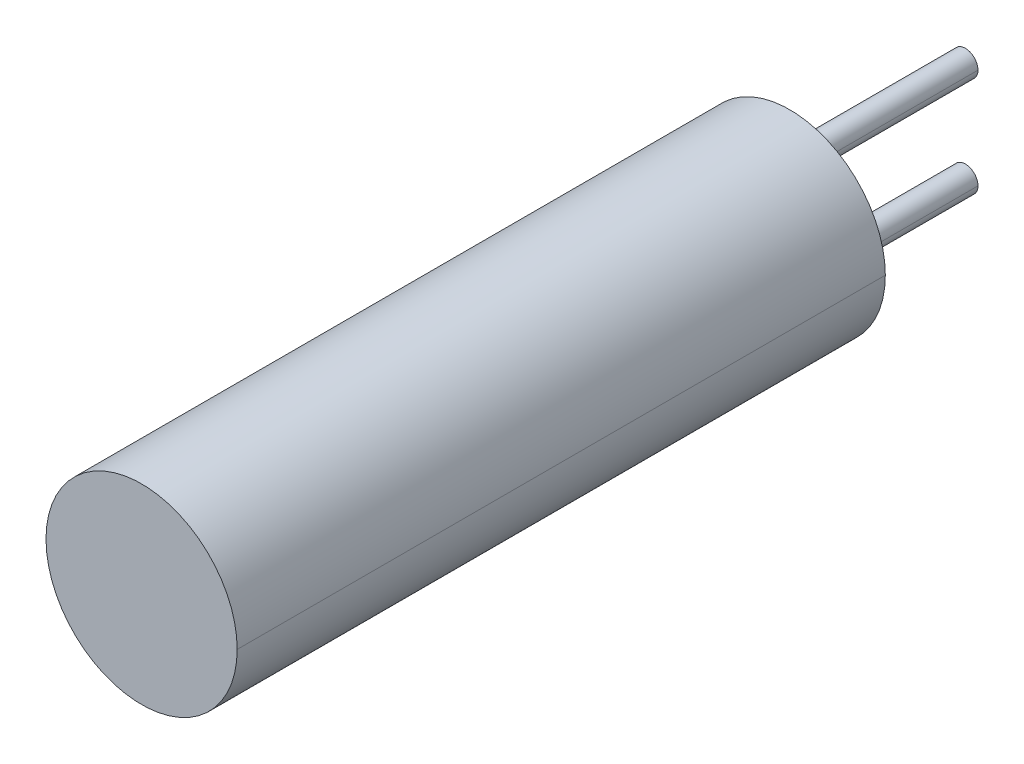
ISO-10303-21;
HEADER;
FILE_DESCRIPTION(('STEP AP214'),'2;1');
FILE_NAME('part.step','',(''),(''),'','','');
FILE_SCHEMA(('AUTOMOTIVE_DESIGN { 1 0 10303 214 1 1 1 1 }'));
ENDSEC;
DATA;
#1=APPLICATION_CONTEXT('core data for automotive mechanical design processes');
#2=APPLICATION_PROTOCOL_DEFINITION('international standard','automotive_design',2000,#1);
#3=PRODUCT_CONTEXT('',#1,'mechanical');
#4=PRODUCT('Part','Part','',(#3));
#5=PRODUCT_RELATED_PRODUCT_CATEGORY('part','',(#4));
#6=PRODUCT_DEFINITION_FORMATION('','',#4);
#7=PRODUCT_DEFINITION_CONTEXT('part definition',#1,'design');
#8=PRODUCT_DEFINITION('design','',#6,#7);
#9=PRODUCT_DEFINITION_SHAPE('','',#8);
#10=(LENGTH_UNIT() NAMED_UNIT(*) SI_UNIT(.MILLI.,.METRE.));
#11=(NAMED_UNIT(*) PLANE_ANGLE_UNIT() SI_UNIT($,.RADIAN.));
#12=(NAMED_UNIT(*) SI_UNIT($,.STERADIAN.) SOLID_ANGLE_UNIT());
#13=UNCERTAINTY_MEASURE_WITH_UNIT(LENGTH_MEASURE(1.E-05),#10,'distance_accuracy_value','');
#14=(GEOMETRIC_REPRESENTATION_CONTEXT(3) GLOBAL_UNCERTAINTY_ASSIGNED_CONTEXT((#13)) GLOBAL_UNIT_ASSIGNED_CONTEXT((#10,
#11,#12)) REPRESENTATION_CONTEXT('',''));
#15=CARTESIAN_POINT('',(0.,0.,0.));
#16=DIRECTION('',(0.,0.,1.));
#17=DIRECTION('',(1.,0.,0.));
#18=AXIS2_PLACEMENT_3D('',#15,#16,#17);
#19=CARTESIAN_POINT('',(0.,0.,0.));
#20=DIRECTION('',(0.,0.,1.));
#21=DIRECTION('',(-1.,0.,0.));
#22=AXIS2_PLACEMENT_3D('',#19,#20,#21);
#23=PLANE('',#22);
#24=CARTESIAN_POINT('',(0.,0.,0.));
#25=DIRECTION('',(0.,0.,1.));
#26=DIRECTION('',(-1.,0.,0.));
#27=AXIS2_PLACEMENT_3D('',#24,#25,#26);
#28=CIRCLE('',#27,2.95);
#29=CARTESIAN_POINT('',(-2.95,0.,0.));
#30=VERTEX_POINT('',#29);
#31=CARTESIAN_POINT('',(2.95,0.,0.));
#32=VERTEX_POINT('',#31);
#33=EDGE_CURVE('E38',#30,#32,#28,.T.);
#34=ORIENTED_EDGE('',*,*,#33,.F.);
#35=CARTESIAN_POINT('',(0.,0.,0.));
#36=DIRECTION('',(0.,0.,1.));
#37=DIRECTION('',(1.,0.,0.));
#38=AXIS2_PLACEMENT_3D('',#35,#36,#37);
#39=CIRCLE('',#38,2.95);
#40=EDGE_CURVE('E105',#32,#30,#39,.T.);
#41=ORIENTED_EDGE('',*,*,#40,.F.);
#42=EDGE_LOOP('',(#34,#41));
#43=FACE_BOUND('',#42,.T.);
#44=CARTESIAN_POINT('',(0.,1.489822979376,0.));
#45=DIRECTION('',(0.,0.,-1.));
#46=DIRECTION('',(1.,0.,0.));
#47=AXIS2_PLACEMENT_3D('',#44,#45,#46);
#48=CIRCLE('',#47,0.3898185985847);
#49=CARTESIAN_POINT('',(0.3898185985847,1.489822979376,0.));
#50=VERTEX_POINT('',#49);
#51=CARTESIAN_POINT('',(-0.3898185985847,1.489822979376,0.));
#52=VERTEX_POINT('',#51);
#53=EDGE_CURVE('E83',#50,#52,#48,.T.);
#54=ORIENTED_EDGE('',*,*,#53,.F.);
#55=CARTESIAN_POINT('',(0.,1.489822979376,0.));
#56=DIRECTION('',(0.,0.,-1.));
#57=DIRECTION('',(-1.,0.,0.));
#58=AXIS2_PLACEMENT_3D('',#55,#56,#57);
#59=CIRCLE('',#58,0.3898185985847);
#60=EDGE_CURVE('E116',#52,#50,#59,.T.);
#61=ORIENTED_EDGE('',*,*,#60,.F.);
#62=EDGE_LOOP('',(#54,#61));
#63=FACE_BOUND('',#62,.T.);
#64=CARTESIAN_POINT('',(0.,-1.602262449517,0.));
#65=DIRECTION('',(0.,0.,-1.));
#66=DIRECTION('',(1.,0.,0.));
#67=AXIS2_PLACEMENT_3D('',#64,#65,#66);
#68=CIRCLE('',#67,0.3898185985847);
#69=CARTESIAN_POINT('',(0.3898185985847,-1.602262449517,0.));
#70=VERTEX_POINT('',#69);
#71=CARTESIAN_POINT('',(-0.3898185985847,-1.602262449517,0.));
#72=VERTEX_POINT('',#71);
#73=EDGE_CURVE('E85',#70,#72,#68,.T.);
#74=ORIENTED_EDGE('',*,*,#73,.F.);
#75=CARTESIAN_POINT('',(0.,-1.602262449517,0.));
#76=DIRECTION('',(0.,0.,-1.));
#77=DIRECTION('',(-1.,0.,0.));
#78=AXIS2_PLACEMENT_3D('',#75,#76,#77);
#79=CIRCLE('',#78,0.3898185985847);
#80=EDGE_CURVE('E79',#72,#70,#79,.T.);
#81=ORIENTED_EDGE('',*,*,#80,.F.);
#82=EDGE_LOOP('',(#74,#81));
#83=FACE_BOUND('',#82,.T.);
#84=ADVANCED_FACE('F17',(#43,#63,#83),#23,.F.);
#85=CARTESIAN_POINT('',(0.,0.,0.));
#86=DIRECTION('',(0.,0.,1.));
#87=DIRECTION('',(-1.,0.,0.));
#88=AXIS2_PLACEMENT_3D('',#85,#86,#87);
#89=CYLINDRICAL_SURFACE('',#88,2.95);
#90=DIRECTION('',(0.,0.,-1.));
#91=VECTOR('',#90,1.);
#92=CARTESIAN_POINT('',(-2.95,0.,20.));
#93=LINE('',#92,#91);
#94=CARTESIAN_POINT('',(-2.95,0.,20.));
#95=VERTEX_POINT('',#94);
#96=EDGE_CURVE('E102',#30,#95,#93,.F.);
#97=ORIENTED_EDGE('',*,*,#96,.T.);
#98=CARTESIAN_POINT('',(0.,0.,20.));
#99=DIRECTION('',(0.,0.,-1.));
#100=DIRECTION('',(-1.,0.,0.));
#101=AXIS2_PLACEMENT_3D('',#98,#99,#100);
#102=CIRCLE('',#101,2.95);
#103=CARTESIAN_POINT('',(2.95,0.,20.));
#104=VERTEX_POINT('',#103);
#105=EDGE_CURVE('E11',#95,#104,#102,.T.);
#106=ORIENTED_EDGE('',*,*,#105,.T.);
#107=DIRECTION('',(0.,0.,-1.));
#108=VECTOR('',#107,1.);
#109=CARTESIAN_POINT('',(2.95,0.,20.));
#110=LINE('',#109,#108);
#111=EDGE_CURVE('E29',#32,#104,#110,.F.);
#112=ORIENTED_EDGE('',*,*,#111,.F.);
#113=ORIENTED_EDGE('',*,*,#40,.T.);
#114=EDGE_LOOP('',(#97,#106,#112,#113));
#115=FACE_BOUND('',#114,.T.);
#116=ADVANCED_FACE('F141',(#115),#89,.T.);
#117=CARTESIAN_POINT('',(0.,0.,0.));
#118=DIRECTION('',(0.,0.,1.));
#119=DIRECTION('',(-1.,0.,0.));
#120=AXIS2_PLACEMENT_3D('',#117,#118,#119);
#121=CYLINDRICAL_SURFACE('',#120,2.95);
#122=ORIENTED_EDGE('',*,*,#111,.T.);
#123=CARTESIAN_POINT('',(0.,0.,20.));
#124=DIRECTION('',(0.,0.,-1.));
#125=DIRECTION('',(1.,0.,0.));
#126=AXIS2_PLACEMENT_3D('',#123,#124,#125);
#127=CIRCLE('',#126,2.95);
#128=EDGE_CURVE('E110',#104,#95,#127,.T.);
#129=ORIENTED_EDGE('',*,*,#128,.T.);
#130=ORIENTED_EDGE('',*,*,#96,.F.);
#131=ORIENTED_EDGE('',*,*,#33,.T.);
#132=EDGE_LOOP('',(#122,#129,#130,#131));
#133=FACE_BOUND('',#132,.T.);
#134=ADVANCED_FACE('F148',(#133),#121,.T.);
#135=CARTESIAN_POINT('',(0.,0.,20.));
#136=DIRECTION('',(0.,0.,1.));
#137=DIRECTION('',(-1.,0.,0.));
#138=AXIS2_PLACEMENT_3D('',#135,#136,#137);
#139=PLANE('',#138);
#140=ORIENTED_EDGE('',*,*,#128,.F.);
#141=ORIENTED_EDGE('',*,*,#105,.F.);
#142=EDGE_LOOP('',(#140,#141));
#143=FACE_BOUND('',#142,.T.);
#144=ADVANCED_FACE('F149',(#143),#139,.T.);
#145=CARTESIAN_POINT('',(0.,1.489822979376,0.));
#146=DIRECTION('',(0.,0.,-1.));
#147=DIRECTION('',(1.,0.,0.));
#148=AXIS2_PLACEMENT_3D('',#145,#146,#147);
#149=CYLINDRICAL_SURFACE('',#148,0.3898185985847);
#150=DIRECTION('',(0.,0.,1.));
#151=VECTOR('',#150,1.);
#152=CARTESIAN_POINT('',(0.3898185985847,1.489822979376,-5.42));
#153=LINE('',#152,#151);
#154=CARTESIAN_POINT('',(0.3898185985847,1.489822979376,-5.42));
#155=VERTEX_POINT('',#154);
#156=EDGE_CURVE('E120',#155,#50,#153,.T.);
#157=ORIENTED_EDGE('',*,*,#156,.F.);
#158=CARTESIAN_POINT('',(0.,1.489822979376,-5.42));
#159=DIRECTION('',(0.,0.,1.));
#160=DIRECTION('',(1.,0.,0.));
#161=AXIS2_PLACEMENT_3D('',#158,#159,#160);
#162=CIRCLE('',#161,0.3898185985847);
#163=CARTESIAN_POINT('',(-0.3898185985847,1.489822979376,-5.42));
#164=VERTEX_POINT('',#163);
#165=EDGE_CURVE('E113',#155,#164,#162,.T.);
#166=ORIENTED_EDGE('',*,*,#165,.T.);
#167=DIRECTION('',(0.,0.,1.));
#168=VECTOR('',#167,1.);
#169=CARTESIAN_POINT('',(-0.3898185985847,1.489822979376,-5.42));
#170=LINE('',#169,#168);
#171=EDGE_CURVE('E112',#164,#52,#170,.T.);
#172=ORIENTED_EDGE('',*,*,#171,.T.);
#173=ORIENTED_EDGE('',*,*,#60,.T.);
#174=EDGE_LOOP('',(#157,#166,#172,#173));
#175=FACE_BOUND('',#174,.T.);
#176=ADVANCED_FACE('F151',(#175),#149,.T.);
#177=CARTESIAN_POINT('',(0.,1.489822979376,0.));
#178=DIRECTION('',(0.,0.,-1.));
#179=DIRECTION('',(1.,0.,0.));
#180=AXIS2_PLACEMENT_3D('',#177,#178,#179);
#181=CYLINDRICAL_SURFACE('',#180,0.3898185985847);
#182=ORIENTED_EDGE('',*,*,#171,.F.);
#183=CARTESIAN_POINT('',(0.,1.489822979376,-5.42));
#184=DIRECTION('',(0.,0.,1.));
#185=DIRECTION('',(-1.,0.,0.));
#186=AXIS2_PLACEMENT_3D('',#183,#184,#185);
#187=CIRCLE('',#186,0.3898185985847);
#188=EDGE_CURVE('E122',#164,#155,#187,.T.);
#189=ORIENTED_EDGE('',*,*,#188,.T.);
#190=ORIENTED_EDGE('',*,*,#156,.T.);
#191=ORIENTED_EDGE('',*,*,#53,.T.);
#192=EDGE_LOOP('',(#182,#189,#190,#191));
#193=FACE_BOUND('',#192,.T.);
#194=ADVANCED_FACE('F157',(#193),#181,.T.);
#195=CARTESIAN_POINT('',(0.,0.,-5.42));
#196=DIRECTION('',(0.,0.,-1.));
#197=DIRECTION('',(1.,0.,0.));
#198=AXIS2_PLACEMENT_3D('',#195,#196,#197);
#199=PLANE('',#198);
#200=ORIENTED_EDGE('',*,*,#188,.F.);
#201=ORIENTED_EDGE('',*,*,#165,.F.);
#202=EDGE_LOOP('',(#200,#201));
#203=FACE_BOUND('',#202,.T.);
#204=ADVANCED_FACE('F179',(#203),#199,.T.);
#205=CARTESIAN_POINT('',(0.,-1.602262449517,0.));
#206=DIRECTION('',(0.,0.,-1.));
#207=DIRECTION('',(1.,0.,0.));
#208=AXIS2_PLACEMENT_3D('',#205,#206,#207);
#209=CYLINDRICAL_SURFACE('',#208,0.3898185985847);
#210=DIRECTION('',(0.,0.,1.));
#211=VECTOR('',#210,1.);
#212=CARTESIAN_POINT('',(0.3898185985847,-1.602262449517,-5.42));
#213=LINE('',#212,#211);
#214=CARTESIAN_POINT('',(0.3898185985847,-1.602262449517,-5.42));
#215=VERTEX_POINT('',#214);
#216=EDGE_CURVE('E72',#215,#70,#213,.T.);
#217=ORIENTED_EDGE('',*,*,#216,.F.);
#218=CARTESIAN_POINT('',(0.,-1.602262449517,-5.42));
#219=DIRECTION('',(0.,0.,1.));
#220=DIRECTION('',(1.,0.,0.));
#221=AXIS2_PLACEMENT_3D('',#218,#219,#220);
#222=CIRCLE('',#221,0.3898185985847);
#223=CARTESIAN_POINT('',(-0.3898185985847,-1.602262449517,-5.42));
#224=VERTEX_POINT('',#223);
#225=EDGE_CURVE('E80',#215,#224,#222,.T.);
#226=ORIENTED_EDGE('',*,*,#225,.T.);
#227=DIRECTION('',(0.,0.,1.));
#228=VECTOR('',#227,1.);
#229=CARTESIAN_POINT('',(-0.3898185985847,-1.602262449517,-5.42));
#230=LINE('',#229,#228);
#231=EDGE_CURVE('E68',#224,#72,#230,.T.);
#232=ORIENTED_EDGE('',*,*,#231,.T.);
#233=ORIENTED_EDGE('',*,*,#80,.T.);
#234=EDGE_LOOP('',(#217,#226,#232,#233));
#235=FACE_BOUND('',#234,.T.);
#236=ADVANCED_FACE('F76',(#235),#209,.T.);
#237=CARTESIAN_POINT('',(0.,-1.602262449517,0.));
#238=DIRECTION('',(0.,0.,-1.));
#239=DIRECTION('',(1.,0.,0.));
#240=AXIS2_PLACEMENT_3D('',#237,#238,#239);
#241=CYLINDRICAL_SURFACE('',#240,0.3898185985847);
#242=ORIENTED_EDGE('',*,*,#231,.F.);
#243=CARTESIAN_POINT('',(0.,-1.602262449517,-5.42));
#244=DIRECTION('',(0.,0.,1.));
#245=DIRECTION('',(-1.,0.,0.));
#246=AXIS2_PLACEMENT_3D('',#243,#244,#245);
#247=CIRCLE('',#246,0.3898185985847);
#248=EDGE_CURVE('E21',#224,#215,#247,.T.);
#249=ORIENTED_EDGE('',*,*,#248,.T.);
#250=ORIENTED_EDGE('',*,*,#216,.T.);
#251=ORIENTED_EDGE('',*,*,#73,.T.);
#252=EDGE_LOOP('',(#242,#249,#250,#251));
#253=FACE_BOUND('',#252,.T.);
#254=ADVANCED_FACE('F87',(#253),#241,.T.);
#255=CARTESIAN_POINT('',(0.,0.,-5.42));
#256=DIRECTION('',(0.,0.,-1.));
#257=DIRECTION('',(1.,0.,0.));
#258=AXIS2_PLACEMENT_3D('',#255,#256,#257);
#259=PLANE('',#258);
#260=ORIENTED_EDGE('',*,*,#248,.F.);
#261=ORIENTED_EDGE('',*,*,#225,.F.);
#262=EDGE_LOOP('',(#260,#261));
#263=FACE_BOUND('',#262,.T.);
#264=ADVANCED_FACE('F19',(#263),#259,.T.);
#265=CLOSED_SHELL('',(#84,#116,#134,#144,#176,#194,#204,#236,#254,#264));
#266=MANIFOLD_SOLID_BREP('B1',#265);
#267=ADVANCED_BREP_SHAPE_REPRESENTATION('',(#18,#266),#14);
#268=SHAPE_DEFINITION_REPRESENTATION(#9,#267);
ENDSEC;
END-ISO-10303-21;
